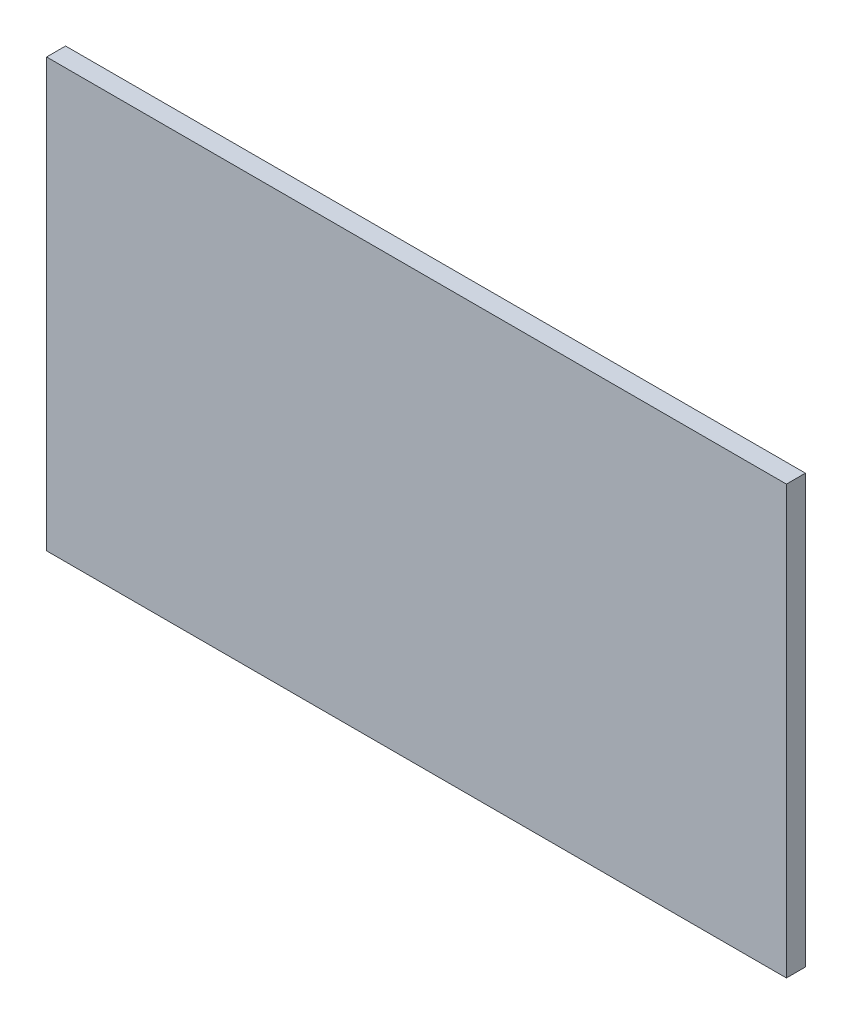
ISO-10303-21;
HEADER;
FILE_DESCRIPTION(('STEP AP214'),'2;1');
FILE_NAME('part.step','',(''),(''),'','','');
FILE_SCHEMA(('AUTOMOTIVE_DESIGN { 1 0 10303 214 1 1 1 1 }'));
ENDSEC;
DATA;
#1=APPLICATION_CONTEXT('core data for automotive mechanical design processes');
#2=APPLICATION_PROTOCOL_DEFINITION('international standard','automotive_design',2000,#1);
#3=PRODUCT_CONTEXT('',#1,'mechanical');
#4=PRODUCT('Part','Part','',(#3));
#5=PRODUCT_RELATED_PRODUCT_CATEGORY('part','',(#4));
#6=PRODUCT_DEFINITION_FORMATION('','',#4);
#7=PRODUCT_DEFINITION_CONTEXT('part definition',#1,'design');
#8=PRODUCT_DEFINITION('design','',#6,#7);
#9=PRODUCT_DEFINITION_SHAPE('','',#8);
#10=(LENGTH_UNIT() NAMED_UNIT(*) SI_UNIT(.MILLI.,.METRE.));
#11=(NAMED_UNIT(*) PLANE_ANGLE_UNIT() SI_UNIT($,.RADIAN.));
#12=(NAMED_UNIT(*) SI_UNIT($,.STERADIAN.) SOLID_ANGLE_UNIT());
#13=UNCERTAINTY_MEASURE_WITH_UNIT(LENGTH_MEASURE(1.E-05),#10,'distance_accuracy_value','');
#14=(GEOMETRIC_REPRESENTATION_CONTEXT(3) GLOBAL_UNCERTAINTY_ASSIGNED_CONTEXT((#13)) GLOBAL_UNIT_ASSIGNED_CONTEXT((#10,
#11,#12)) REPRESENTATION_CONTEXT('',''));
#15=CARTESIAN_POINT('',(0.,0.,0.));
#16=DIRECTION('',(0.,0.,1.));
#17=DIRECTION('',(1.,0.,0.));
#18=AXIS2_PLACEMENT_3D('',#15,#16,#17);
#19=CARTESIAN_POINT('',(148.49,-85.85,7.62));
#20=DIRECTION('',(-1.,0.,0.));
#21=DIRECTION('',(0.,0.,1.));
#22=AXIS2_PLACEMENT_3D('',#19,#20,#21);
#23=PLANE('',#22);
#24=DIRECTION('',(0.,1.,0.));
#25=VECTOR('',#24,1.);
#26=CARTESIAN_POINT('',(148.49,-85.85,0.));
#27=LINE('',#26,#25);
#28=CARTESIAN_POINT('',(148.49,-85.85,0.));
#29=VERTEX_POINT('',#28);
#30=CARTESIAN_POINT('',(148.49,85.85,0.));
#31=VERTEX_POINT('',#30);
#32=EDGE_CURVE('E114',#29,#31,#27,.T.);
#33=ORIENTED_EDGE('',*,*,#32,.T.);
#34=DIRECTION('',(0.,0.,-1.));
#35=VECTOR('',#34,1.);
#36=CARTESIAN_POINT('',(148.49,85.85,7.62));
#37=LINE('',#36,#35);
#38=CARTESIAN_POINT('',(148.49,85.85,7.62));
#39=VERTEX_POINT('',#38);
#40=EDGE_CURVE('E11',#39,#31,#37,.T.);
#41=ORIENTED_EDGE('',*,*,#40,.F.);
#42=DIRECTION('',(0.,1.,0.));
#43=VECTOR('',#42,1.);
#44=CARTESIAN_POINT('',(148.49,-85.85,7.62));
#45=LINE('',#44,#43);
#46=CARTESIAN_POINT('',(148.49,-85.85,7.62));
#47=VERTEX_POINT('',#46);
#48=EDGE_CURVE('E98',#47,#39,#45,.T.);
#49=ORIENTED_EDGE('',*,*,#48,.F.);
#50=DIRECTION('',(0.,0.,-1.));
#51=VECTOR('',#50,1.);
#52=CARTESIAN_POINT('',(148.49,-85.85,7.62));
#53=LINE('',#52,#51);
#54=EDGE_CURVE('E110',#47,#29,#53,.T.);
#55=ORIENTED_EDGE('',*,*,#54,.T.);
#56=EDGE_LOOP('',(#33,#41,#49,#55));
#57=FACE_BOUND('',#56,.T.);
#58=ADVANCED_FACE('F46',(#57),#23,.F.);
#59=CARTESIAN_POINT('',(-148.49,85.85,7.62));
#60=DIRECTION('',(0.,-1.,0.));
#61=DIRECTION('',(0.,0.,-1.));
#62=AXIS2_PLACEMENT_3D('',#59,#60,#61);
#63=PLANE('',#62);
#64=DIRECTION('',(-1.,0.,0.));
#65=VECTOR('',#64,1.);
#66=CARTESIAN_POINT('',(-148.49,85.85,0.));
#67=LINE('',#66,#65);
#68=CARTESIAN_POINT('',(-148.49,85.85,0.));
#69=VERTEX_POINT('',#68);
#70=EDGE_CURVE('E103',#31,#69,#67,.T.);
#71=ORIENTED_EDGE('',*,*,#70,.T.);
#72=DIRECTION('',(0.,0.,-1.));
#73=VECTOR('',#72,1.);
#74=CARTESIAN_POINT('',(-148.49,85.85,7.62));
#75=LINE('',#74,#73);
#76=CARTESIAN_POINT('',(-148.49,85.85,7.62));
#77=VERTEX_POINT('',#76);
#78=EDGE_CURVE('E55',#77,#69,#75,.T.);
#79=ORIENTED_EDGE('',*,*,#78,.F.);
#80=DIRECTION('',(-1.,0.,0.));
#81=VECTOR('',#80,1.);
#82=CARTESIAN_POINT('',(-148.49,85.85,7.62));
#83=LINE('',#82,#81);
#84=EDGE_CURVE('E93',#39,#77,#83,.T.);
#85=ORIENTED_EDGE('',*,*,#84,.F.);
#86=ORIENTED_EDGE('',*,*,#40,.T.);
#87=EDGE_LOOP('',(#71,#79,#85,#86));
#88=FACE_BOUND('',#87,.T.);
#89=ADVANCED_FACE('F102',(#88),#63,.F.);
#90=CARTESIAN_POINT('',(-148.49,-85.85,7.62));
#91=DIRECTION('',(1.,0.,0.));
#92=DIRECTION('',(0.,0.,-1.));
#93=AXIS2_PLACEMENT_3D('',#90,#91,#92);
#94=PLANE('',#93);
#95=DIRECTION('',(0.,-1.,0.));
#96=VECTOR('',#95,1.);
#97=CARTESIAN_POINT('',(-148.49,-85.85,0.));
#98=LINE('',#97,#96);
#99=CARTESIAN_POINT('',(-148.49,-85.85,0.));
#100=VERTEX_POINT('',#99);
#101=EDGE_CURVE('E80',#69,#100,#98,.T.);
#102=ORIENTED_EDGE('',*,*,#101,.T.);
#103=DIRECTION('',(0.,0.,-1.));
#104=VECTOR('',#103,1.);
#105=CARTESIAN_POINT('',(-148.49,-85.85,7.62));
#106=LINE('',#105,#104);
#107=CARTESIAN_POINT('',(-148.49,-85.85,7.62));
#108=VERTEX_POINT('',#107);
#109=EDGE_CURVE('E105',#108,#100,#106,.T.);
#110=ORIENTED_EDGE('',*,*,#109,.F.);
#111=DIRECTION('',(0.,-1.,0.));
#112=VECTOR('',#111,1.);
#113=CARTESIAN_POINT('',(-148.49,-85.85,7.62));
#114=LINE('',#113,#112);
#115=EDGE_CURVE('E96',#77,#108,#114,.T.);
#116=ORIENTED_EDGE('',*,*,#115,.F.);
#117=ORIENTED_EDGE('',*,*,#78,.T.);
#118=EDGE_LOOP('',(#102,#110,#116,#117));
#119=FACE_BOUND('',#118,.T.);
#120=ADVANCED_FACE('F106',(#119),#94,.F.);
#121=CARTESIAN_POINT('',(-148.49,-85.85,7.62));
#122=DIRECTION('',(0.,1.,0.));
#123=DIRECTION('',(0.,0.,1.));
#124=AXIS2_PLACEMENT_3D('',#121,#122,#123);
#125=PLANE('',#124);
#126=DIRECTION('',(1.,0.,0.));
#127=VECTOR('',#126,1.);
#128=CARTESIAN_POINT('',(-148.49,-85.85,0.));
#129=LINE('',#128,#127);
#130=EDGE_CURVE('E86',#100,#29,#129,.T.);
#131=ORIENTED_EDGE('',*,*,#130,.T.);
#132=ORIENTED_EDGE('',*,*,#54,.F.);
#133=DIRECTION('',(1.,0.,0.));
#134=VECTOR('',#133,1.);
#135=CARTESIAN_POINT('',(-148.49,-85.85,7.62));
#136=LINE('',#135,#134);
#137=EDGE_CURVE('E63',#108,#47,#136,.T.);
#138=ORIENTED_EDGE('',*,*,#137,.F.);
#139=ORIENTED_EDGE('',*,*,#109,.T.);
#140=EDGE_LOOP('',(#131,#132,#138,#139));
#141=FACE_BOUND('',#140,.T.);
#142=ADVANCED_FACE('F127',(#141),#125,.F.);
#143=CARTESIAN_POINT('',(0.,0.,7.62));
#144=DIRECTION('',(0.,0.,-1.));
#145=DIRECTION('',(-1.,0.,0.));
#146=AXIS2_PLACEMENT_3D('',#143,#144,#145);
#147=PLANE('',#146);
#148=ORIENTED_EDGE('',*,*,#48,.T.);
#149=ORIENTED_EDGE('',*,*,#84,.T.);
#150=ORIENTED_EDGE('',*,*,#115,.T.);
#151=ORIENTED_EDGE('',*,*,#137,.T.);
#152=EDGE_LOOP('',(#148,#149,#150,#151));
#153=FACE_BOUND('',#152,.T.);
#154=ADVANCED_FACE('F94',(#153),#147,.F.);
#155=CARTESIAN_POINT('',(0.,0.,0.));
#156=DIRECTION('',(0.,0.,-1.));
#157=DIRECTION('',(-1.,0.,0.));
#158=AXIS2_PLACEMENT_3D('',#155,#156,#157);
#159=PLANE('',#158);
#160=ORIENTED_EDGE('',*,*,#32,.F.);
#161=ORIENTED_EDGE('',*,*,#130,.F.);
#162=ORIENTED_EDGE('',*,*,#101,.F.);
#163=ORIENTED_EDGE('',*,*,#70,.F.);
#164=EDGE_LOOP('',(#160,#161,#162,#163));
#165=FACE_BOUND('',#164,.T.);
#166=ADVANCED_FACE('F130',(#165),#159,.T.);
#167=CLOSED_SHELL('',(#58,#89,#120,#142,#154,#166));
#168=MANIFOLD_SOLID_BREP('B2',#167);
#169=ADVANCED_BREP_SHAPE_REPRESENTATION('',(#18,#168),#14);
#170=SHAPE_DEFINITION_REPRESENTATION(#9,#169);
ENDSEC;
END-ISO-10303-21;
